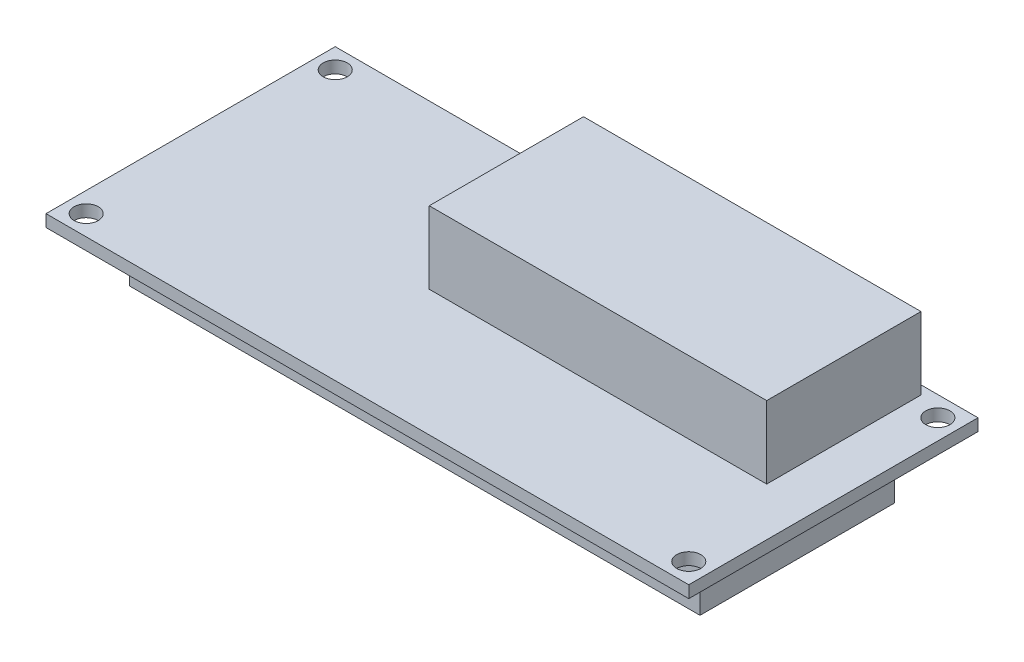
ISO-10303-21;
HEADER;
FILE_DESCRIPTION(('STEP AP214'),'2;1');
FILE_NAME('part.step','',(''),(''),'','','');
FILE_SCHEMA(('AUTOMOTIVE_DESIGN { 1 0 10303 214 1 1 1 1 }'));
ENDSEC;
DATA;
#1=APPLICATION_CONTEXT('core data for automotive mechanical design processes');
#2=APPLICATION_PROTOCOL_DEFINITION('international standard','automotive_design',2000,#1);
#3=PRODUCT_CONTEXT('',#1,'mechanical');
#4=PRODUCT('Part','Part','',(#3));
#5=PRODUCT_RELATED_PRODUCT_CATEGORY('part','',(#4));
#6=PRODUCT_DEFINITION_FORMATION('','',#4);
#7=PRODUCT_DEFINITION_CONTEXT('part definition',#1,'design');
#8=PRODUCT_DEFINITION('design','',#6,#7);
#9=PRODUCT_DEFINITION_SHAPE('','',#8);
#10=(LENGTH_UNIT() NAMED_UNIT(*) SI_UNIT(.MILLI.,.METRE.));
#11=(NAMED_UNIT(*) PLANE_ANGLE_UNIT() SI_UNIT($,.RADIAN.));
#12=(NAMED_UNIT(*) SI_UNIT($,.STERADIAN.) SOLID_ANGLE_UNIT());
#13=UNCERTAINTY_MEASURE_WITH_UNIT(LENGTH_MEASURE(1.E-05),#10,'distance_accuracy_value','');
#14=(GEOMETRIC_REPRESENTATION_CONTEXT(3) GLOBAL_UNCERTAINTY_ASSIGNED_CONTEXT((#13)) GLOBAL_UNIT_ASSIGNED_CONTEXT((#10,
#11,#12)) REPRESENTATION_CONTEXT('',''));
#15=CARTESIAN_POINT('',(0.,0.,0.));
#16=DIRECTION('',(0.,0.,1.));
#17=DIRECTION('',(1.,0.,0.));
#18=AXIS2_PLACEMENT_3D('',#15,#16,#17);
#19=CARTESIAN_POINT('',(0.,1.5,0.));
#20=DIRECTION('',(0.,1.,0.));
#21=DIRECTION('',(0.,0.,1.));
#22=AXIS2_PLACEMENT_3D('',#19,#20,#21);
#23=PLANE('',#22);
#24=CARTESIAN_POINT('',(-21.1363636363636,1.5,-8.04545454545454));
#25=DIRECTION('',(0.,1.,0.));
#26=DIRECTION('',(0.,0.,1.));
#27=AXIS2_PLACEMENT_3D('',#24,#25,#26);
#28=CIRCLE('',#27,1.5);
#29=CARTESIAN_POINT('',(-21.1363636363636,1.5,-6.54545454545454));
#30=VERTEX_POINT('',#29);
#31=EDGE_CURVE('E309',#30,#30,#28,.T.);
#32=ORIENTED_EDGE('',*,*,#31,.F.);
#33=EDGE_LOOP('',(#32));
#34=FACE_BOUND('',#33,.T.);
#35=CARTESIAN_POINT('',(-21.1363636363636,1.5,22.9545454545455));
#36=DIRECTION('',(0.,1.,0.));
#37=DIRECTION('',(0.,0.,1.));
#38=AXIS2_PLACEMENT_3D('',#35,#36,#37);
#39=CIRCLE('',#38,1.5);
#40=CARTESIAN_POINT('',(-21.1363636363636,1.5,24.4545454545455));
#41=VERTEX_POINT('',#40);
#42=EDGE_CURVE('E325',#41,#41,#39,.T.);
#43=ORIENTED_EDGE('',*,*,#42,.F.);
#44=EDGE_LOOP('',(#43));
#45=FACE_BOUND('',#44,.T.);
#46=DIRECTION('',(0.,0.,1.));
#47=VECTOR('',#46,1.);
#48=CARTESIAN_POINT('',(-23.6363636363636,1.5,-10.5454545454545));
#49=LINE('',#48,#47);
#50=CARTESIAN_POINT('',(-23.6363636363636,1.5,-10.5454545454545));
#51=VERTEX_POINT('',#50);
#52=CARTESIAN_POINT('',(-23.6363636363636,1.5,25.4545454545455));
#53=VERTEX_POINT('',#52);
#54=EDGE_CURVE('E333',#51,#53,#49,.T.);
#55=ORIENTED_EDGE('',*,*,#54,.T.);
#56=DIRECTION('',(1.,0.,0.));
#57=VECTOR('',#56,1.);
#58=CARTESIAN_POINT('',(-23.6363636363636,1.5,25.4545454545455));
#59=LINE('',#58,#57);
#60=CARTESIAN_POINT('',(56.3636363636364,1.5,25.4545454545455));
#61=VERTEX_POINT('',#60);
#62=EDGE_CURVE('E337',#53,#61,#59,.T.);
#63=ORIENTED_EDGE('',*,*,#62,.T.);
#64=DIRECTION('',(0.,0.,-1.));
#65=VECTOR('',#64,1.);
#66=CARTESIAN_POINT('',(56.3636363636364,1.5,-10.5454545454545));
#67=LINE('',#66,#65);
#68=CARTESIAN_POINT('',(56.3636363636364,1.5,-10.5454545454545));
#69=VERTEX_POINT('',#68);
#70=EDGE_CURVE('E341',#61,#69,#67,.T.);
#71=ORIENTED_EDGE('',*,*,#70,.T.);
#72=DIRECTION('',(-1.,0.,0.));
#73=VECTOR('',#72,1.);
#74=CARTESIAN_POINT('',(-23.6363636363636,1.5,-10.5454545454545));
#75=LINE('',#74,#73);
#76=EDGE_CURVE('E344',#69,#51,#75,.T.);
#77=ORIENTED_EDGE('',*,*,#76,.T.);
#78=EDGE_LOOP('',(#55,#63,#71,#77));
#79=FACE_BOUND('',#78,.T.);
#80=CARTESIAN_POINT('',(53.8636363636364,1.5,-8.04545454545454));
#81=DIRECTION('',(0.,1.,0.));
#82=DIRECTION('',(0.,0.,1.));
#83=AXIS2_PLACEMENT_3D('',#80,#81,#82);
#84=CIRCLE('',#83,1.5);
#85=CARTESIAN_POINT('',(53.8636363636364,1.5,-6.54545454545454));
#86=VERTEX_POINT('',#85);
#87=EDGE_CURVE('E317',#86,#86,#84,.T.);
#88=ORIENTED_EDGE('',*,*,#87,.F.);
#89=EDGE_LOOP('',(#88));
#90=FACE_BOUND('',#89,.T.);
#91=CARTESIAN_POINT('',(53.8636363636364,1.5,22.9545454545455));
#92=DIRECTION('',(0.,1.,0.));
#93=DIRECTION('',(0.,0.,1.));
#94=AXIS2_PLACEMENT_3D('',#91,#92,#93);
#95=CIRCLE('',#94,1.5);
#96=CARTESIAN_POINT('',(53.8636363636364,1.5,24.4545454545455));
#97=VERTEX_POINT('',#96);
#98=EDGE_CURVE('E301',#97,#97,#95,.T.);
#99=ORIENTED_EDGE('',*,*,#98,.F.);
#100=EDGE_LOOP('',(#99));
#101=FACE_BOUND('',#100,.T.);
#102=DIRECTION('',(1.,0.,0.));
#103=VECTOR('',#102,1.);
#104=CARTESIAN_POINT('',(8.36363636363639,1.5,9.75454545454546));
#105=LINE('',#104,#103);
#106=CARTESIAN_POINT('',(8.36363636363639,1.5,9.75454545454546));
#107=VERTEX_POINT('',#106);
#108=CARTESIAN_POINT('',(50.3636363636364,1.5,9.75454545454546));
#109=VERTEX_POINT('',#108);
#110=EDGE_CURVE('E235',#107,#109,#105,.T.);
#111=ORIENTED_EDGE('',*,*,#110,.F.);
#112=DIRECTION('',(0.,0.,1.));
#113=VECTOR('',#112,1.);
#114=CARTESIAN_POINT('',(8.36363636363639,1.5,-9.44545454545454));
#115=LINE('',#114,#113);
#116=CARTESIAN_POINT('',(8.36363636363639,1.5,-9.44545454545454));
#117=VERTEX_POINT('',#116);
#118=EDGE_CURVE('E211',#117,#107,#115,.T.);
#119=ORIENTED_EDGE('',*,*,#118,.F.);
#120=DIRECTION('',(-1.,0.,0.));
#121=VECTOR('',#120,1.);
#122=CARTESIAN_POINT('',(8.36363636363639,1.5,-9.44545454545454));
#123=LINE('',#122,#121);
#124=CARTESIAN_POINT('',(50.3636363636364,1.5,-9.44545454545454));
#125=VERTEX_POINT('',#124);
#126=EDGE_CURVE('E222',#125,#117,#123,.T.);
#127=ORIENTED_EDGE('',*,*,#126,.F.);
#128=DIRECTION('',(0.,0.,-1.));
#129=VECTOR('',#128,1.);
#130=CARTESIAN_POINT('',(50.3636363636364,1.5,-9.44545454545454));
#131=LINE('',#130,#129);
#132=EDGE_CURVE('E238',#109,#125,#131,.T.);
#133=ORIENTED_EDGE('',*,*,#132,.F.);
#134=EDGE_LOOP('',(#111,#119,#127,#133));
#135=FACE_BOUND('',#134,.T.);
#136=ADVANCED_FACE('F51',(#34,#45,#79,#90,#101,#135),#23,.T.);
#137=CARTESIAN_POINT('',(0.,0.,0.));
#138=DIRECTION('',(0.,1.,0.));
#139=DIRECTION('',(0.,0.,1.));
#140=AXIS2_PLACEMENT_3D('',#137,#138,#139);
#141=PLANE('',#140);
#142=CARTESIAN_POINT('',(53.8636363636364,0.,22.9545454545455));
#143=DIRECTION('',(0.,1.,0.));
#144=DIRECTION('',(0.,0.,1.));
#145=AXIS2_PLACEMENT_3D('',#142,#143,#144);
#146=CIRCLE('',#145,1.5);
#147=CARTESIAN_POINT('',(53.8636363636364,0.,24.4545454545455));
#148=VERTEX_POINT('',#147);
#149=EDGE_CURVE('E300',#148,#148,#146,.T.);
#150=ORIENTED_EDGE('',*,*,#149,.T.);
#151=EDGE_LOOP('',(#150));
#152=FACE_BOUND('',#151,.T.);
#153=CARTESIAN_POINT('',(-21.1363636363636,0.,-8.04545454545454));
#154=DIRECTION('',(0.,1.,0.));
#155=DIRECTION('',(0.,0.,1.));
#156=AXIS2_PLACEMENT_3D('',#153,#154,#155);
#157=CIRCLE('',#156,1.5);
#158=CARTESIAN_POINT('',(-21.1363636363636,0.,-6.54545454545454));
#159=VERTEX_POINT('',#158);
#160=EDGE_CURVE('E305',#159,#159,#157,.T.);
#161=ORIENTED_EDGE('',*,*,#160,.T.);
#162=EDGE_LOOP('',(#161));
#163=FACE_BOUND('',#162,.T.);
#164=CARTESIAN_POINT('',(53.8636363636364,0.,-8.04545454545454));
#165=DIRECTION('',(0.,1.,0.));
#166=DIRECTION('',(0.,0.,1.));
#167=AXIS2_PLACEMENT_3D('',#164,#165,#166);
#168=CIRCLE('',#167,1.5);
#169=CARTESIAN_POINT('',(53.8636363636364,0.,-6.54545454545454));
#170=VERTEX_POINT('',#169);
#171=EDGE_CURVE('E313',#170,#170,#168,.T.);
#172=ORIENTED_EDGE('',*,*,#171,.T.);
#173=EDGE_LOOP('',(#172));
#174=FACE_BOUND('',#173,.T.);
#175=CARTESIAN_POINT('',(-21.1363636363636,0.,22.9545454545455));
#176=DIRECTION('',(0.,1.,0.));
#177=DIRECTION('',(0.,0.,1.));
#178=AXIS2_PLACEMENT_3D('',#175,#176,#177);
#179=CIRCLE('',#178,1.5);
#180=CARTESIAN_POINT('',(-21.1363636363636,0.,24.4545454545455));
#181=VERTEX_POINT('',#180);
#182=EDGE_CURVE('E321',#181,#181,#179,.T.);
#183=ORIENTED_EDGE('',*,*,#182,.T.);
#184=EDGE_LOOP('',(#183));
#185=FACE_BOUND('',#184,.T.);
#186=DIRECTION('',(0.,0.,1.));
#187=VECTOR('',#186,1.);
#188=CARTESIAN_POINT('',(-23.6363636363636,0.,-10.5454545454545));
#189=LINE('',#188,#187);
#190=CARTESIAN_POINT('',(-23.6363636363636,0.,-10.5454545454545));
#191=VERTEX_POINT('',#190);
#192=CARTESIAN_POINT('',(-23.6363636363636,0.,25.4545454545455));
#193=VERTEX_POINT('',#192);
#194=EDGE_CURVE('E329',#191,#193,#189,.T.);
#195=ORIENTED_EDGE('',*,*,#194,.F.);
#196=DIRECTION('',(-1.,0.,0.));
#197=VECTOR('',#196,1.);
#198=CARTESIAN_POINT('',(-23.6363636363636,0.,-10.5454545454545));
#199=LINE('',#198,#197);
#200=CARTESIAN_POINT('',(56.3636363636364,0.,-10.5454545454545));
#201=VERTEX_POINT('',#200);
#202=EDGE_CURVE('E338',#201,#191,#199,.T.);
#203=ORIENTED_EDGE('',*,*,#202,.F.);
#204=DIRECTION('',(0.,0.,-1.));
#205=VECTOR('',#204,1.);
#206=CARTESIAN_POINT('',(56.3636363636364,0.,-10.5454545454545));
#207=LINE('',#206,#205);
#208=CARTESIAN_POINT('',(56.3636363636364,0.,25.4545454545455));
#209=VERTEX_POINT('',#208);
#210=EDGE_CURVE('E354',#209,#201,#207,.T.);
#211=ORIENTED_EDGE('',*,*,#210,.F.);
#212=DIRECTION('',(1.,0.,0.));
#213=VECTOR('',#212,1.);
#214=CARTESIAN_POINT('',(-23.6363636363636,0.,25.4545454545455));
#215=LINE('',#214,#213);
#216=EDGE_CURVE('E351',#193,#209,#215,.T.);
#217=ORIENTED_EDGE('',*,*,#216,.F.);
#218=EDGE_LOOP('',(#195,#203,#211,#217));
#219=FACE_BOUND('',#218,.T.);
#220=DIRECTION('',(0.,0.,-1.));
#221=VECTOR('',#220,1.);
#222=CARTESIAN_POINT('',(-19.1363636363636,0.,19.5545454545455));
#223=LINE('',#222,#221);
#224=CARTESIAN_POINT('',(-19.1363636363636,0.,19.5545454545455));
#225=VERTEX_POINT('',#224);
#226=CARTESIAN_POINT('',(-19.1363636363636,0.,-4.64545454545454));
#227=VERTEX_POINT('',#226);
#228=EDGE_CURVE('E255',#225,#227,#223,.T.);
#229=ORIENTED_EDGE('',*,*,#228,.F.);
#230=DIRECTION('',(-1.,0.,0.));
#231=VECTOR('',#230,1.);
#232=CARTESIAN_POINT('',(-19.1363636363636,0.,19.5545454545455));
#233=LINE('',#232,#231);
#234=CARTESIAN_POINT('',(51.8636363636364,0.,19.5545454545455));
#235=VERTEX_POINT('',#234);
#236=EDGE_CURVE('E261',#235,#225,#233,.T.);
#237=ORIENTED_EDGE('',*,*,#236,.F.);
#238=DIRECTION('',(0.,0.,1.));
#239=VECTOR('',#238,1.);
#240=CARTESIAN_POINT('',(51.8636363636364,0.,19.5545454545455));
#241=LINE('',#240,#239);
#242=CARTESIAN_POINT('',(51.8636363636364,0.,-4.64545454545454));
#243=VERTEX_POINT('',#242);
#244=EDGE_CURVE('E278',#243,#235,#241,.T.);
#245=ORIENTED_EDGE('',*,*,#244,.F.);
#246=DIRECTION('',(1.,0.,0.));
#247=VECTOR('',#246,1.);
#248=CARTESIAN_POINT('',(-19.1363636363636,0.,-4.64545454545454));
#249=LINE('',#248,#247);
#250=EDGE_CURVE('E274',#227,#243,#249,.T.);
#251=ORIENTED_EDGE('',*,*,#250,.F.);
#252=EDGE_LOOP('',(#229,#237,#245,#251));
#253=FACE_BOUND('',#252,.T.);
#254=ADVANCED_FACE('F377',(#152,#163,#174,#185,#219,#253),#141,.F.);
#255=CARTESIAN_POINT('',(-23.6363636363636,1.5,-10.5454545454545));
#256=DIRECTION('',(1.,0.,0.));
#257=DIRECTION('',(0.,0.,-1.));
#258=AXIS2_PLACEMENT_3D('',#255,#256,#257);
#259=PLANE('',#258);
#260=ORIENTED_EDGE('',*,*,#194,.T.);
#261=DIRECTION('',(0.,-1.,0.));
#262=VECTOR('',#261,1.);
#263=CARTESIAN_POINT('',(-23.6363636363636,1.5,25.4545454545455));
#264=LINE('',#263,#262);
#265=EDGE_CURVE('E11',#53,#193,#264,.T.);
#266=ORIENTED_EDGE('',*,*,#265,.F.);
#267=ORIENTED_EDGE('',*,*,#54,.F.);
#268=DIRECTION('',(0.,-1.,0.));
#269=VECTOR('',#268,1.);
#270=CARTESIAN_POINT('',(-23.6363636363636,1.5,-10.5454545454545));
#271=LINE('',#270,#269);
#272=EDGE_CURVE('E347',#51,#191,#271,.T.);
#273=ORIENTED_EDGE('',*,*,#272,.T.);
#274=EDGE_LOOP('',(#260,#266,#267,#273));
#275=FACE_BOUND('',#274,.T.);
#276=ADVANCED_FACE('F53',(#275),#259,.F.);
#277=CARTESIAN_POINT('',(-23.6363636363636,1.5,25.4545454545455));
#278=DIRECTION('',(0.,0.,-1.));
#279=DIRECTION('',(-1.,0.,0.));
#280=AXIS2_PLACEMENT_3D('',#277,#278,#279);
#281=PLANE('',#280);
#282=ORIENTED_EDGE('',*,*,#216,.T.);
#283=DIRECTION('',(0.,-1.,0.));
#284=VECTOR('',#283,1.);
#285=CARTESIAN_POINT('',(56.3636363636364,1.5,25.4545454545455));
#286=LINE('',#285,#284);
#287=EDGE_CURVE('E60',#61,#209,#286,.T.);
#288=ORIENTED_EDGE('',*,*,#287,.F.);
#289=ORIENTED_EDGE('',*,*,#62,.F.);
#290=ORIENTED_EDGE('',*,*,#265,.T.);
#291=EDGE_LOOP('',(#282,#288,#289,#290));
#292=FACE_BOUND('',#291,.T.);
#293=ADVANCED_FACE('F388',(#292),#281,.F.);
#294=CARTESIAN_POINT('',(56.3636363636364,1.5,-10.5454545454545));
#295=DIRECTION('',(-1.,0.,0.));
#296=DIRECTION('',(0.,0.,1.));
#297=AXIS2_PLACEMENT_3D('',#294,#295,#296);
#298=PLANE('',#297);
#299=ORIENTED_EDGE('',*,*,#210,.T.);
#300=DIRECTION('',(0.,-1.,0.));
#301=VECTOR('',#300,1.);
#302=CARTESIAN_POINT('',(56.3636363636364,1.5,-10.5454545454545));
#303=LINE('',#302,#301);
#304=EDGE_CURVE('E362',#69,#201,#303,.T.);
#305=ORIENTED_EDGE('',*,*,#304,.F.);
#306=ORIENTED_EDGE('',*,*,#70,.F.);
#307=ORIENTED_EDGE('',*,*,#287,.T.);
#308=EDGE_LOOP('',(#299,#305,#306,#307));
#309=FACE_BOUND('',#308,.T.);
#310=ADVANCED_FACE('F371',(#309),#298,.F.);
#311=CARTESIAN_POINT('',(-23.6363636363636,1.5,-10.5454545454545));
#312=DIRECTION('',(0.,0.,1.));
#313=DIRECTION('',(1.,0.,0.));
#314=AXIS2_PLACEMENT_3D('',#311,#312,#313);
#315=PLANE('',#314);
#316=ORIENTED_EDGE('',*,*,#202,.T.);
#317=ORIENTED_EDGE('',*,*,#272,.F.);
#318=ORIENTED_EDGE('',*,*,#76,.F.);
#319=ORIENTED_EDGE('',*,*,#304,.T.);
#320=EDGE_LOOP('',(#316,#317,#318,#319));
#321=FACE_BOUND('',#320,.T.);
#322=ADVANCED_FACE('F381',(#321),#315,.F.);
#323=CARTESIAN_POINT('',(-21.1363636363636,1.5,22.9545454545455));
#324=DIRECTION('',(0.,-1.,0.));
#325=DIRECTION('',(0.,0.,-1.));
#326=AXIS2_PLACEMENT_3D('',#323,#324,#325);
#327=CYLINDRICAL_SURFACE('',#326,1.5);
#328=ORIENTED_EDGE('',*,*,#42,.T.);
#329=EDGE_LOOP('',(#328));
#330=FACE_BOUND('',#329,.T.);
#331=ORIENTED_EDGE('',*,*,#182,.F.);
#332=EDGE_LOOP('',(#331));
#333=FACE_BOUND('',#332,.T.);
#334=ADVANCED_FACE('F406',(#330,#333),#327,.F.);
#335=CARTESIAN_POINT('',(53.8636363636364,1.5,-8.04545454545454));
#336=DIRECTION('',(0.,-1.,0.));
#337=DIRECTION('',(0.,0.,-1.));
#338=AXIS2_PLACEMENT_3D('',#335,#336,#337);
#339=CYLINDRICAL_SURFACE('',#338,1.5);
#340=ORIENTED_EDGE('',*,*,#87,.T.);
#341=EDGE_LOOP('',(#340));
#342=FACE_BOUND('',#341,.T.);
#343=ORIENTED_EDGE('',*,*,#171,.F.);
#344=EDGE_LOOP('',(#343));
#345=FACE_BOUND('',#344,.T.);
#346=ADVANCED_FACE('F413',(#342,#345),#339,.F.);
#347=CARTESIAN_POINT('',(-21.1363636363636,1.5,-8.04545454545454));
#348=DIRECTION('',(0.,-1.,0.));
#349=DIRECTION('',(0.,0.,-1.));
#350=AXIS2_PLACEMENT_3D('',#347,#348,#349);
#351=CYLINDRICAL_SURFACE('',#350,1.5);
#352=ORIENTED_EDGE('',*,*,#31,.T.);
#353=EDGE_LOOP('',(#352));
#354=FACE_BOUND('',#353,.T.);
#355=ORIENTED_EDGE('',*,*,#160,.F.);
#356=EDGE_LOOP('',(#355));
#357=FACE_BOUND('',#356,.T.);
#358=ADVANCED_FACE('F418',(#354,#357),#351,.F.);
#359=CARTESIAN_POINT('',(53.8636363636364,1.5,22.9545454545455));
#360=DIRECTION('',(0.,-1.,0.));
#361=DIRECTION('',(0.,0.,-1.));
#362=AXIS2_PLACEMENT_3D('',#359,#360,#361);
#363=CYLINDRICAL_SURFACE('',#362,1.5);
#364=ORIENTED_EDGE('',*,*,#98,.T.);
#365=EDGE_LOOP('',(#364));
#366=FACE_BOUND('',#365,.T.);
#367=ORIENTED_EDGE('',*,*,#149,.F.);
#368=EDGE_LOOP('',(#367));
#369=FACE_BOUND('',#368,.T.);
#370=ADVANCED_FACE('F427',(#366,#369),#363,.F.);
#371=CARTESIAN_POINT('',(-19.1363636363636,-7.,19.5545454545455));
#372=DIRECTION('',(1.,0.,0.));
#373=DIRECTION('',(0.,0.,-1.));
#374=AXIS2_PLACEMENT_3D('',#371,#372,#373);
#375=PLANE('',#374);
#376=ORIENTED_EDGE('',*,*,#228,.T.);
#377=DIRECTION('',(0.,1.,0.));
#378=VECTOR('',#377,1.);
#379=CARTESIAN_POINT('',(-19.1363636363636,-7.,-4.64545454545454));
#380=LINE('',#379,#378);
#381=CARTESIAN_POINT('',(-19.1363636363636,-7.,-4.64545454545454));
#382=VERTEX_POINT('',#381);
#383=EDGE_CURVE('E296',#382,#227,#380,.T.);
#384=ORIENTED_EDGE('',*,*,#383,.F.);
#385=DIRECTION('',(0.,0.,-1.));
#386=VECTOR('',#385,1.);
#387=CARTESIAN_POINT('',(-19.1363636363636,-7.,19.5545454545455));
#388=LINE('',#387,#386);
#389=CARTESIAN_POINT('',(-19.1363636363636,-7.,19.5545454545455));
#390=VERTEX_POINT('',#389);
#391=EDGE_CURVE('E256',#390,#382,#388,.T.);
#392=ORIENTED_EDGE('',*,*,#391,.F.);
#393=DIRECTION('',(0.,1.,0.));
#394=VECTOR('',#393,1.);
#395=CARTESIAN_POINT('',(-19.1363636363636,-7.,19.5545454545455));
#396=LINE('',#395,#394);
#397=EDGE_CURVE('E270',#390,#225,#396,.T.);
#398=ORIENTED_EDGE('',*,*,#397,.T.);
#399=EDGE_LOOP('',(#376,#384,#392,#398));
#400=FACE_BOUND('',#399,.T.);
#401=ADVANCED_FACE('F434',(#400),#375,.F.);
#402=CARTESIAN_POINT('',(-19.1363636363636,-7.,-4.64545454545454));
#403=DIRECTION('',(0.,0.,1.));
#404=DIRECTION('',(1.,0.,0.));
#405=AXIS2_PLACEMENT_3D('',#402,#403,#404);
#406=PLANE('',#405);
#407=ORIENTED_EDGE('',*,*,#250,.T.);
#408=DIRECTION('',(0.,1.,0.));
#409=VECTOR('',#408,1.);
#410=CARTESIAN_POINT('',(51.8636363636364,-7.,-4.64545454545454));
#411=LINE('',#410,#409);
#412=CARTESIAN_POINT('',(51.8636363636364,-7.,-4.64545454545454));
#413=VERTEX_POINT('',#412);
#414=EDGE_CURVE('E292',#413,#243,#411,.T.);
#415=ORIENTED_EDGE('',*,*,#414,.F.);
#416=DIRECTION('',(1.,0.,0.));
#417=VECTOR('',#416,1.);
#418=CARTESIAN_POINT('',(-19.1363636363636,-7.,-4.64545454545454));
#419=LINE('',#418,#417);
#420=EDGE_CURVE('E260',#382,#413,#419,.T.);
#421=ORIENTED_EDGE('',*,*,#420,.F.);
#422=ORIENTED_EDGE('',*,*,#383,.T.);
#423=EDGE_LOOP('',(#407,#415,#421,#422));
#424=FACE_BOUND('',#423,.T.);
#425=ADVANCED_FACE('F438',(#424),#406,.F.);
#426=CARTESIAN_POINT('',(51.8636363636364,-7.,19.5545454545455));
#427=DIRECTION('',(-1.,0.,0.));
#428=DIRECTION('',(0.,0.,1.));
#429=AXIS2_PLACEMENT_3D('',#426,#427,#428);
#430=PLANE('',#429);
#431=ORIENTED_EDGE('',*,*,#244,.T.);
#432=DIRECTION('',(0.,1.,0.));
#433=VECTOR('',#432,1.);
#434=CARTESIAN_POINT('',(51.8636363636364,-7.,19.5545454545455));
#435=LINE('',#434,#433);
#436=CARTESIAN_POINT('',(51.8636363636364,-7.,19.5545454545455));
#437=VERTEX_POINT('',#436);
#438=EDGE_CURVE('E288',#437,#235,#435,.T.);
#439=ORIENTED_EDGE('',*,*,#438,.F.);
#440=DIRECTION('',(0.,0.,1.));
#441=VECTOR('',#440,1.);
#442=CARTESIAN_POINT('',(51.8636363636364,-7.,19.5545454545455));
#443=LINE('',#442,#441);
#444=EDGE_CURVE('E264',#413,#437,#443,.T.);
#445=ORIENTED_EDGE('',*,*,#444,.F.);
#446=ORIENTED_EDGE('',*,*,#414,.T.);
#447=EDGE_LOOP('',(#431,#439,#445,#446));
#448=FACE_BOUND('',#447,.T.);
#449=ADVANCED_FACE('F442',(#448),#430,.F.);
#450=CARTESIAN_POINT('',(-19.1363636363636,-7.,19.5545454545455));
#451=DIRECTION('',(0.,0.,-1.));
#452=DIRECTION('',(-1.,0.,0.));
#453=AXIS2_PLACEMENT_3D('',#450,#451,#452);
#454=PLANE('',#453);
#455=ORIENTED_EDGE('',*,*,#236,.T.);
#456=ORIENTED_EDGE('',*,*,#397,.F.);
#457=DIRECTION('',(-1.,0.,0.));
#458=VECTOR('',#457,1.);
#459=CARTESIAN_POINT('',(-19.1363636363636,-7.,19.5545454545455));
#460=LINE('',#459,#458);
#461=EDGE_CURVE('E267',#437,#390,#460,.T.);
#462=ORIENTED_EDGE('',*,*,#461,.F.);
#463=ORIENTED_EDGE('',*,*,#438,.T.);
#464=EDGE_LOOP('',(#455,#456,#462,#463));
#465=FACE_BOUND('',#464,.T.);
#466=ADVANCED_FACE('F446',(#465),#454,.F.);
#467=CARTESIAN_POINT('',(0.,-7.,0.));
#468=DIRECTION('',(0.,-1.,0.));
#469=DIRECTION('',(0.,0.,-1.));
#470=AXIS2_PLACEMENT_3D('',#467,#468,#469);
#471=PLANE('',#470);
#472=DIRECTION('',(0.,0.,1.));
#473=VECTOR('',#472,1.);
#474=CARTESIAN_POINT('',(48.5636363636364,-7.,14.7045454545455));
#475=LINE('',#474,#473);
#476=CARTESIAN_POINT('',(48.5636363636364,-7.,0.204545454545462));
#477=VERTEX_POINT('',#476);
#478=CARTESIAN_POINT('',(48.5636363636364,-7.,14.7045454545455));
#479=VERTEX_POINT('',#478);
#480=EDGE_CURVE('E67',#477,#479,#475,.T.);
#481=ORIENTED_EDGE('',*,*,#480,.F.);
#482=DIRECTION('',(1.,0.,0.));
#483=VECTOR('',#482,1.);
#484=CARTESIAN_POINT('',(-15.8363636363636,-7.,0.204545454545462));
#485=LINE('',#484,#483);
#486=CARTESIAN_POINT('',(-15.8363636363636,-7.,0.204545454545462));
#487=VERTEX_POINT('',#486);
#488=EDGE_CURVE('E189',#487,#477,#485,.T.);
#489=ORIENTED_EDGE('',*,*,#488,.F.);
#490=DIRECTION('',(0.,0.,-1.));
#491=VECTOR('',#490,1.);
#492=CARTESIAN_POINT('',(-15.8363636363636,-7.,14.7045454545455));
#493=LINE('',#492,#491);
#494=CARTESIAN_POINT('',(-15.8363636363636,-7.,14.7045454545455));
#495=VERTEX_POINT('',#494);
#496=EDGE_CURVE('E193',#495,#487,#493,.T.);
#497=ORIENTED_EDGE('',*,*,#496,.F.);
#498=DIRECTION('',(-1.,0.,0.));
#499=VECTOR('',#498,1.);
#500=CARTESIAN_POINT('',(-15.8363636363636,-7.,14.7045454545455));
#501=LINE('',#500,#499);
#502=EDGE_CURVE('E202',#479,#495,#501,.T.);
#503=ORIENTED_EDGE('',*,*,#502,.F.);
#504=EDGE_LOOP('',(#481,#489,#497,#503));
#505=FACE_BOUND('',#504,.T.);
#506=ORIENTED_EDGE('',*,*,#391,.T.);
#507=ORIENTED_EDGE('',*,*,#420,.T.);
#508=ORIENTED_EDGE('',*,*,#444,.T.);
#509=ORIENTED_EDGE('',*,*,#461,.T.);
#510=EDGE_LOOP('',(#506,#507,#508,#509));
#511=FACE_BOUND('',#510,.T.);
#512=ADVANCED_FACE('F450',(#505,#511),#471,.T.);
#513=CARTESIAN_POINT('',(8.36363636363639,10.5,-9.44545454545454));
#514=DIRECTION('',(1.,0.,0.));
#515=DIRECTION('',(0.,0.,-1.));
#516=AXIS2_PLACEMENT_3D('',#513,#514,#515);
#517=PLANE('',#516);
#518=ORIENTED_EDGE('',*,*,#118,.T.);
#519=DIRECTION('',(0.,-1.,0.));
#520=VECTOR('',#519,1.);
#521=CARTESIAN_POINT('',(8.36363636363639,10.5,9.75454545454546));
#522=LINE('',#521,#520);
#523=CARTESIAN_POINT('',(8.36363636363639,10.5,9.75454545454546));
#524=VERTEX_POINT('',#523);
#525=EDGE_CURVE('E252',#524,#107,#522,.T.);
#526=ORIENTED_EDGE('',*,*,#525,.F.);
#527=DIRECTION('',(0.,0.,1.));
#528=VECTOR('',#527,1.);
#529=CARTESIAN_POINT('',(8.36363636363639,10.5,-9.44545454545454));
#530=LINE('',#529,#528);
#531=CARTESIAN_POINT('',(8.36363636363639,10.5,-9.44545454545454));
#532=VERTEX_POINT('',#531);
#533=EDGE_CURVE('E217',#532,#524,#530,.T.);
#534=ORIENTED_EDGE('',*,*,#533,.F.);
#535=DIRECTION('',(0.,-1.,0.));
#536=VECTOR('',#535,1.);
#537=CARTESIAN_POINT('',(8.36363636363639,10.5,-9.44545454545454));
#538=LINE('',#537,#536);
#539=EDGE_CURVE('E231',#532,#117,#538,.T.);
#540=ORIENTED_EDGE('',*,*,#539,.T.);
#541=EDGE_LOOP('',(#518,#526,#534,#540));
#542=FACE_BOUND('',#541,.T.);
#543=ADVANCED_FACE('F454',(#542),#517,.F.);
#544=CARTESIAN_POINT('',(8.36363636363639,10.5,9.75454545454546));
#545=DIRECTION('',(0.,0.,-1.));
#546=DIRECTION('',(-1.,0.,0.));
#547=AXIS2_PLACEMENT_3D('',#544,#545,#546);
#548=PLANE('',#547);
#549=ORIENTED_EDGE('',*,*,#110,.T.);
#550=DIRECTION('',(0.,-1.,0.));
#551=VECTOR('',#550,1.);
#552=CARTESIAN_POINT('',(50.3636363636364,10.5,9.75454545454546));
#553=LINE('',#552,#551);
#554=CARTESIAN_POINT('',(50.3636363636364,10.5,9.75454545454546));
#555=VERTEX_POINT('',#554);
#556=EDGE_CURVE('E248',#555,#109,#553,.T.);
#557=ORIENTED_EDGE('',*,*,#556,.F.);
#558=DIRECTION('',(1.,0.,0.));
#559=VECTOR('',#558,1.);
#560=CARTESIAN_POINT('',(8.36363636363639,10.5,9.75454545454546));
#561=LINE('',#560,#559);
#562=EDGE_CURVE('E221',#524,#555,#561,.T.);
#563=ORIENTED_EDGE('',*,*,#562,.F.);
#564=ORIENTED_EDGE('',*,*,#525,.T.);
#565=EDGE_LOOP('',(#549,#557,#563,#564));
#566=FACE_BOUND('',#565,.T.);
#567=ADVANCED_FACE('F458',(#566),#548,.F.);
#568=CARTESIAN_POINT('',(50.3636363636364,10.5,-9.44545454545454));
#569=DIRECTION('',(-1.,0.,0.));
#570=DIRECTION('',(0.,0.,1.));
#571=AXIS2_PLACEMENT_3D('',#568,#569,#570);
#572=PLANE('',#571);
#573=ORIENTED_EDGE('',*,*,#132,.T.);
#574=DIRECTION('',(0.,-1.,0.));
#575=VECTOR('',#574,1.);
#576=CARTESIAN_POINT('',(50.3636363636364,10.5,-9.44545454545454));
#577=LINE('',#576,#575);
#578=CARTESIAN_POINT('',(50.3636363636364,10.5,-9.44545454545454));
#579=VERTEX_POINT('',#578);
#580=EDGE_CURVE('E75',#579,#125,#577,.T.);
#581=ORIENTED_EDGE('',*,*,#580,.F.);
#582=DIRECTION('',(0.,0.,-1.));
#583=VECTOR('',#582,1.);
#584=CARTESIAN_POINT('',(50.3636363636364,10.5,-9.44545454545454));
#585=LINE('',#584,#583);
#586=EDGE_CURVE('E225',#555,#579,#585,.T.);
#587=ORIENTED_EDGE('',*,*,#586,.F.);
#588=ORIENTED_EDGE('',*,*,#556,.T.);
#589=EDGE_LOOP('',(#573,#581,#587,#588));
#590=FACE_BOUND('',#589,.T.);
#591=ADVANCED_FACE('F462',(#590),#572,.F.);
#592=CARTESIAN_POINT('',(8.36363636363639,10.5,-9.44545454545454));
#593=DIRECTION('',(0.,0.,1.));
#594=DIRECTION('',(1.,0.,0.));
#595=AXIS2_PLACEMENT_3D('',#592,#593,#594);
#596=PLANE('',#595);
#597=ORIENTED_EDGE('',*,*,#126,.T.);
#598=ORIENTED_EDGE('',*,*,#539,.F.);
#599=DIRECTION('',(-1.,0.,0.));
#600=VECTOR('',#599,1.);
#601=CARTESIAN_POINT('',(8.36363636363639,10.5,-9.44545454545454));
#602=LINE('',#601,#600);
#603=EDGE_CURVE('E228',#579,#532,#602,.T.);
#604=ORIENTED_EDGE('',*,*,#603,.F.);
#605=ORIENTED_EDGE('',*,*,#580,.T.);
#606=EDGE_LOOP('',(#597,#598,#604,#605));
#607=FACE_BOUND('',#606,.T.);
#608=ADVANCED_FACE('F466',(#607),#596,.F.);
#609=CARTESIAN_POINT('',(0.,10.5,0.));
#610=DIRECTION('',(0.,1.,0.));
#611=DIRECTION('',(0.,0.,1.));
#612=AXIS2_PLACEMENT_3D('',#609,#610,#611);
#613=PLANE('',#612);
#614=ORIENTED_EDGE('',*,*,#533,.T.);
#615=ORIENTED_EDGE('',*,*,#562,.T.);
#616=ORIENTED_EDGE('',*,*,#586,.T.);
#617=ORIENTED_EDGE('',*,*,#603,.T.);
#618=EDGE_LOOP('',(#614,#615,#616,#617));
#619=FACE_BOUND('',#618,.T.);
#620=ADVANCED_FACE('F470',(#619),#613,.T.);
#621=CARTESIAN_POINT('',(48.5636363636364,-6.9,14.7045454545455));
#622=DIRECTION('',(1.,0.,0.));
#623=DIRECTION('',(0.,0.,-1.));
#624=AXIS2_PLACEMENT_3D('',#621,#622,#623);
#625=PLANE('',#624);
#626=ORIENTED_EDGE('',*,*,#480,.T.);
#627=DIRECTION('',(0.,-1.,0.));
#628=VECTOR('',#627,1.);
#629=CARTESIAN_POINT('',(48.5636363636364,-6.9,14.7045454545455));
#630=LINE('',#629,#628);
#631=CARTESIAN_POINT('',(48.5636363636364,-6.9,14.7045454545455));
#632=VERTEX_POINT('',#631);
#633=EDGE_CURVE('E164',#632,#479,#630,.T.);
#634=ORIENTED_EDGE('',*,*,#633,.F.);
#635=DIRECTION('',(0.,0.,1.));
#636=VECTOR('',#635,1.);
#637=CARTESIAN_POINT('',(48.5636363636364,-6.9,14.7045454545455));
#638=LINE('',#637,#636);
#639=CARTESIAN_POINT('',(48.5636363636364,-6.9,0.204545454545462));
#640=VERTEX_POINT('',#639);
#641=EDGE_CURVE('E168',#640,#632,#638,.T.);
#642=ORIENTED_EDGE('',*,*,#641,.F.);
#643=DIRECTION('',(0.,-1.,0.));
#644=VECTOR('',#643,1.);
#645=CARTESIAN_POINT('',(48.5636363636364,-6.9,0.204545454545462));
#646=LINE('',#645,#644);
#647=EDGE_CURVE('E208',#640,#477,#646,.T.);
#648=ORIENTED_EDGE('',*,*,#647,.T.);
#649=EDGE_LOOP('',(#626,#634,#642,#648));
#650=FACE_BOUND('',#649,.T.);
#651=ADVANCED_FACE('F166',(#650),#625,.F.);
#652=CARTESIAN_POINT('',(-15.8363636363636,-6.9,0.204545454545462));
#653=DIRECTION('',(0.,0.,-1.));
#654=DIRECTION('',(-1.,0.,0.));
#655=AXIS2_PLACEMENT_3D('',#652,#653,#654);
#656=PLANE('',#655);
#657=ORIENTED_EDGE('',*,*,#488,.T.);
#658=ORIENTED_EDGE('',*,*,#647,.F.);
#659=DIRECTION('',(1.,0.,0.));
#660=VECTOR('',#659,1.);
#661=CARTESIAN_POINT('',(-15.8363636363636,-6.9,0.204545454545462));
#662=LINE('',#661,#660);
#663=CARTESIAN_POINT('',(-15.8363636363636,-6.9,0.204545454545462));
#664=VERTEX_POINT('',#663);
#665=EDGE_CURVE('E175',#664,#640,#662,.T.);
#666=ORIENTED_EDGE('',*,*,#665,.F.);
#667=DIRECTION('',(0.,-1.,0.));
#668=VECTOR('',#667,1.);
#669=CARTESIAN_POINT('',(-15.8363636363636,-6.9,0.204545454545462));
#670=LINE('',#669,#668);
#671=EDGE_CURVE('E212',#664,#487,#670,.T.);
#672=ORIENTED_EDGE('',*,*,#671,.T.);
#673=EDGE_LOOP('',(#657,#658,#666,#672));
#674=FACE_BOUND('',#673,.T.);
#675=ADVANCED_FACE('F476',(#674),#656,.F.);
#676=CARTESIAN_POINT('',(-15.8363636363636,-6.9,14.7045454545455));
#677=DIRECTION('',(-1.,0.,0.));
#678=DIRECTION('',(0.,0.,1.));
#679=AXIS2_PLACEMENT_3D('',#676,#677,#678);
#680=PLANE('',#679);
#681=ORIENTED_EDGE('',*,*,#496,.T.);
#682=ORIENTED_EDGE('',*,*,#671,.F.);
#683=DIRECTION('',(0.,0.,-1.));
#684=VECTOR('',#683,1.);
#685=CARTESIAN_POINT('',(-15.8363636363636,-6.9,14.7045454545455));
#686=LINE('',#685,#684);
#687=CARTESIAN_POINT('',(-15.8363636363636,-6.9,14.7045454545455));
#688=VERTEX_POINT('',#687);
#689=EDGE_CURVE('E184',#688,#664,#686,.T.);
#690=ORIENTED_EDGE('',*,*,#689,.F.);
#691=DIRECTION('',(0.,-1.,0.));
#692=VECTOR('',#691,1.);
#693=CARTESIAN_POINT('',(-15.8363636363636,-6.9,14.7045454545455));
#694=LINE('',#693,#692);
#695=EDGE_CURVE('E174',#688,#495,#694,.T.);
#696=ORIENTED_EDGE('',*,*,#695,.T.);
#697=EDGE_LOOP('',(#681,#682,#690,#696));
#698=FACE_BOUND('',#697,.T.);
#699=ADVANCED_FACE('F479',(#698),#680,.F.);
#700=CARTESIAN_POINT('',(-15.8363636363636,-6.9,14.7045454545455));
#701=DIRECTION('',(0.,0.,1.));
#702=DIRECTION('',(1.,0.,0.));
#703=AXIS2_PLACEMENT_3D('',#700,#701,#702);
#704=PLANE('',#703);
#705=ORIENTED_EDGE('',*,*,#502,.T.);
#706=ORIENTED_EDGE('',*,*,#695,.F.);
#707=DIRECTION('',(-1.,0.,0.));
#708=VECTOR('',#707,1.);
#709=CARTESIAN_POINT('',(-15.8363636363636,-6.9,14.7045454545455));
#710=LINE('',#709,#708);
#711=EDGE_CURVE('E178',#632,#688,#710,.T.);
#712=ORIENTED_EDGE('',*,*,#711,.F.);
#713=ORIENTED_EDGE('',*,*,#633,.T.);
#714=EDGE_LOOP('',(#705,#706,#712,#713));
#715=FACE_BOUND('',#714,.T.);
#716=ADVANCED_FACE('F179',(#715),#704,.F.);
#717=CARTESIAN_POINT('',(0.,-6.9,0.));
#718=DIRECTION('',(0.,-1.,0.));
#719=DIRECTION('',(0.,0.,-1.));
#720=AXIS2_PLACEMENT_3D('',#717,#718,#719);
#721=PLANE('',#720);
#722=ORIENTED_EDGE('',*,*,#641,.T.);
#723=ORIENTED_EDGE('',*,*,#711,.T.);
#724=ORIENTED_EDGE('',*,*,#689,.T.);
#725=ORIENTED_EDGE('',*,*,#665,.T.);
#726=EDGE_LOOP('',(#722,#723,#724,#725));
#727=FACE_BOUND('',#726,.T.);
#728=ADVANCED_FACE('F186',(#727),#721,.T.);
#729=CLOSED_SHELL('',(#136,#254,#276,#293,#310,#322,#334,#346,#358,#370,#401,#425,#449,#466,
#512,#543,#567,#591,#608,#620,#651,#675,#699,#716,#728));
#730=MANIFOLD_SOLID_BREP('B2',#729);
#731=ADVANCED_BREP_SHAPE_REPRESENTATION('',(#18,#730),#14);
#732=SHAPE_DEFINITION_REPRESENTATION(#9,#731);
ENDSEC;
END-ISO-10303-21;
